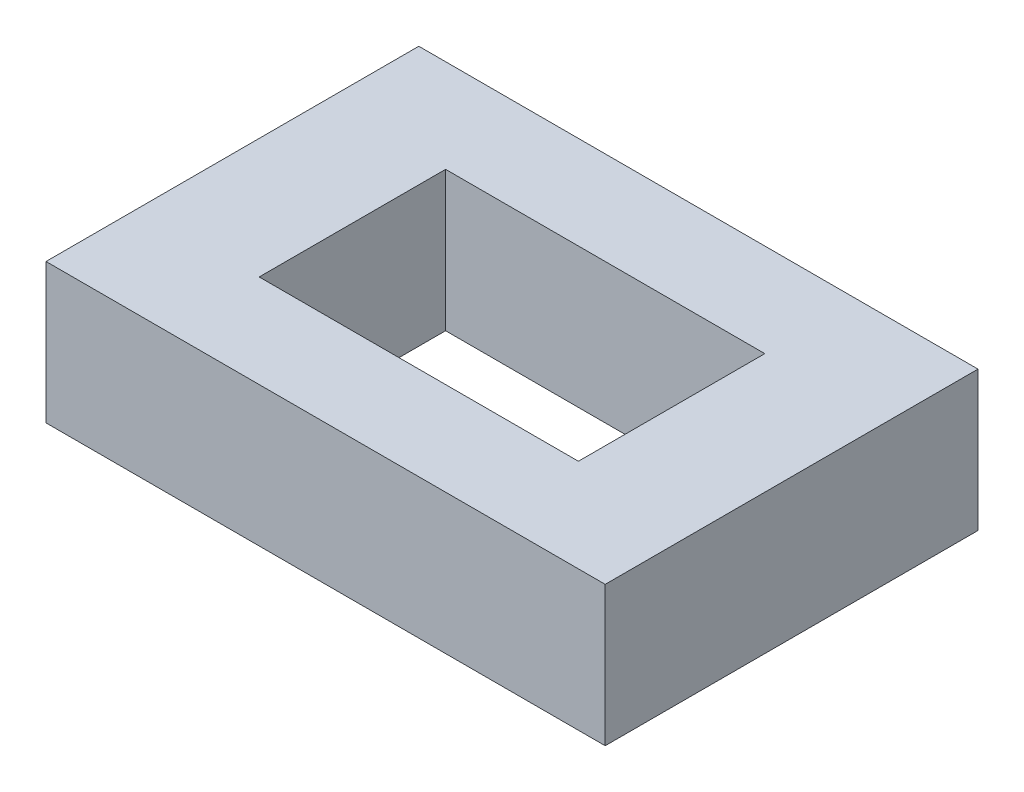
ISO-10303-21;
HEADER;
FILE_DESCRIPTION(('STEP AP214'),'2;1');
FILE_NAME('part.step','',(''),(''),'','','');
FILE_SCHEMA(('AUTOMOTIVE_DESIGN { 1 0 10303 214 1 1 1 1 }'));
ENDSEC;
DATA;
#1=APPLICATION_CONTEXT('core data for automotive mechanical design processes');
#2=APPLICATION_PROTOCOL_DEFINITION('international standard','automotive_design',2000,#1);
#3=PRODUCT_CONTEXT('',#1,'mechanical');
#4=PRODUCT('Part','Part','',(#3));
#5=PRODUCT_RELATED_PRODUCT_CATEGORY('part','',(#4));
#6=PRODUCT_DEFINITION_FORMATION('','',#4);
#7=PRODUCT_DEFINITION_CONTEXT('part definition',#1,'design');
#8=PRODUCT_DEFINITION('design','',#6,#7);
#9=PRODUCT_DEFINITION_SHAPE('','',#8);
#10=(LENGTH_UNIT() NAMED_UNIT(*) SI_UNIT(.MILLI.,.METRE.));
#11=(NAMED_UNIT(*) PLANE_ANGLE_UNIT() SI_UNIT($,.RADIAN.));
#12=(NAMED_UNIT(*) SI_UNIT($,.STERADIAN.) SOLID_ANGLE_UNIT());
#13=UNCERTAINTY_MEASURE_WITH_UNIT(LENGTH_MEASURE(1.E-05),#10,'distance_accuracy_value','');
#14=(GEOMETRIC_REPRESENTATION_CONTEXT(3) GLOBAL_UNCERTAINTY_ASSIGNED_CONTEXT((#13)) GLOBAL_UNIT_ASSIGNED_CONTEXT((#10,
#11,#12)) REPRESENTATION_CONTEXT('',''));
#15=CARTESIAN_POINT('',(0.,0.,0.));
#16=DIRECTION('',(0.,0.,1.));
#17=DIRECTION('',(1.,0.,0.));
#18=AXIS2_PLACEMENT_3D('',#15,#16,#17);
#19=CARTESIAN_POINT('',(6.,3.,4.));
#20=DIRECTION('',(-1.,0.,0.));
#21=DIRECTION('',(0.,0.,1.));
#22=AXIS2_PLACEMENT_3D('',#19,#20,#21);
#23=PLANE('',#22);
#24=DIRECTION('',(0.,0.,-1.));
#25=VECTOR('',#24,1.);
#26=CARTESIAN_POINT('',(6.,0.,4.));
#27=LINE('',#26,#25);
#28=CARTESIAN_POINT('',(6.,0.,4.));
#29=VERTEX_POINT('',#28);
#30=CARTESIAN_POINT('',(6.,0.,-4.));
#31=VERTEX_POINT('',#30);
#32=EDGE_CURVE('E151',#29,#31,#27,.T.);
#33=ORIENTED_EDGE('',*,*,#32,.T.);
#34=DIRECTION('',(0.,-1.,0.));
#35=VECTOR('',#34,1.);
#36=CARTESIAN_POINT('',(6.,3.,-4.));
#37=LINE('',#36,#35);
#38=CARTESIAN_POINT('',(6.,3.,-4.));
#39=VERTEX_POINT('',#38);
#40=EDGE_CURVE('E11',#39,#31,#37,.T.);
#41=ORIENTED_EDGE('',*,*,#40,.F.);
#42=DIRECTION('',(0.,0.,-1.));
#43=VECTOR('',#42,1.);
#44=CARTESIAN_POINT('',(6.,3.,4.));
#45=LINE('',#44,#43);
#46=CARTESIAN_POINT('',(6.,3.,4.));
#47=VERTEX_POINT('',#46);
#48=EDGE_CURVE('E157',#47,#39,#45,.T.);
#49=ORIENTED_EDGE('',*,*,#48,.F.);
#50=DIRECTION('',(0.,-1.,0.));
#51=VECTOR('',#50,1.);
#52=CARTESIAN_POINT('',(6.,3.,4.));
#53=LINE('',#52,#51);
#54=EDGE_CURVE('E171',#47,#29,#53,.T.);
#55=ORIENTED_EDGE('',*,*,#54,.T.);
#56=EDGE_LOOP('',(#33,#41,#49,#55));
#57=FACE_BOUND('',#56,.T.);
#58=ADVANCED_FACE('F43',(#57),#23,.F.);
#59=CARTESIAN_POINT('',(-6.,3.,-4.));
#60=DIRECTION('',(0.,0.,1.));
#61=DIRECTION('',(1.,0.,0.));
#62=AXIS2_PLACEMENT_3D('',#59,#60,#61);
#63=PLANE('',#62);
#64=DIRECTION('',(-1.,0.,0.));
#65=VECTOR('',#64,1.);
#66=CARTESIAN_POINT('',(-6.,0.,-4.));
#67=LINE('',#66,#65);
#68=CARTESIAN_POINT('',(-6.,0.,-4.));
#69=VERTEX_POINT('',#68);
#70=EDGE_CURVE('E175',#31,#69,#67,.T.);
#71=ORIENTED_EDGE('',*,*,#70,.T.);
#72=DIRECTION('',(0.,-1.,0.));
#73=VECTOR('',#72,1.);
#74=CARTESIAN_POINT('',(-6.,3.,-4.));
#75=LINE('',#74,#73);
#76=CARTESIAN_POINT('',(-6.,3.,-4.));
#77=VERTEX_POINT('',#76);
#78=EDGE_CURVE('E51',#77,#69,#75,.T.);
#79=ORIENTED_EDGE('',*,*,#78,.F.);
#80=DIRECTION('',(-1.,0.,0.));
#81=VECTOR('',#80,1.);
#82=CARTESIAN_POINT('',(-6.,3.,-4.));
#83=LINE('',#82,#81);
#84=EDGE_CURVE('E161',#39,#77,#83,.T.);
#85=ORIENTED_EDGE('',*,*,#84,.F.);
#86=ORIENTED_EDGE('',*,*,#40,.T.);
#87=EDGE_LOOP('',(#71,#79,#85,#86));
#88=FACE_BOUND('',#87,.T.);
#89=ADVANCED_FACE('F209',(#88),#63,.F.);
#90=CARTESIAN_POINT('',(-6.,3.,4.));
#91=DIRECTION('',(1.,0.,0.));
#92=DIRECTION('',(0.,0.,-1.));
#93=AXIS2_PLACEMENT_3D('',#90,#91,#92);
#94=PLANE('',#93);
#95=DIRECTION('',(0.,0.,1.));
#96=VECTOR('',#95,1.);
#97=CARTESIAN_POINT('',(-6.,0.,4.));
#98=LINE('',#97,#96);
#99=CARTESIAN_POINT('',(-6.,0.,4.));
#100=VERTEX_POINT('',#99);
#101=EDGE_CURVE('E178',#69,#100,#98,.T.);
#102=ORIENTED_EDGE('',*,*,#101,.T.);
#103=DIRECTION('',(0.,-1.,0.));
#104=VECTOR('',#103,1.);
#105=CARTESIAN_POINT('',(-6.,3.,4.));
#106=LINE('',#105,#104);
#107=CARTESIAN_POINT('',(-6.,3.,4.));
#108=VERTEX_POINT('',#107);
#109=EDGE_CURVE('E186',#108,#100,#106,.T.);
#110=ORIENTED_EDGE('',*,*,#109,.F.);
#111=DIRECTION('',(0.,0.,1.));
#112=VECTOR('',#111,1.);
#113=CARTESIAN_POINT('',(-6.,3.,4.));
#114=LINE('',#113,#112);
#115=EDGE_CURVE('E165',#77,#108,#114,.T.);
#116=ORIENTED_EDGE('',*,*,#115,.F.);
#117=ORIENTED_EDGE('',*,*,#78,.T.);
#118=EDGE_LOOP('',(#102,#110,#116,#117));
#119=FACE_BOUND('',#118,.T.);
#120=ADVANCED_FACE('F195',(#119),#94,.F.);
#121=CARTESIAN_POINT('',(-6.,3.,4.));
#122=DIRECTION('',(0.,0.,-1.));
#123=DIRECTION('',(-1.,0.,0.));
#124=AXIS2_PLACEMENT_3D('',#121,#122,#123);
#125=PLANE('',#124);
#126=DIRECTION('',(1.,0.,0.));
#127=VECTOR('',#126,1.);
#128=CARTESIAN_POINT('',(-6.,0.,4.));
#129=LINE('',#128,#127);
#130=EDGE_CURVE('E162',#100,#29,#129,.T.);
#131=ORIENTED_EDGE('',*,*,#130,.T.);
#132=ORIENTED_EDGE('',*,*,#54,.F.);
#133=DIRECTION('',(1.,0.,0.));
#134=VECTOR('',#133,1.);
#135=CARTESIAN_POINT('',(-6.,3.,4.));
#136=LINE('',#135,#134);
#137=EDGE_CURVE('E168',#108,#47,#136,.T.);
#138=ORIENTED_EDGE('',*,*,#137,.F.);
#139=ORIENTED_EDGE('',*,*,#109,.T.);
#140=EDGE_LOOP('',(#131,#132,#138,#139));
#141=FACE_BOUND('',#140,.T.);
#142=ADVANCED_FACE('F202',(#141),#125,.F.);
#143=CARTESIAN_POINT('',(0.,3.,0.));
#144=DIRECTION('',(0.,-1.,0.));
#145=DIRECTION('',(0.,0.,-1.));
#146=AXIS2_PLACEMENT_3D('',#143,#144,#145);
#147=PLANE('',#146);
#148=DIRECTION('',(-1.,0.,0.));
#149=VECTOR('',#148,1.);
#150=CARTESIAN_POINT('',(-3.425,3.,-2.));
#151=LINE('',#150,#149);
#152=CARTESIAN_POINT('',(3.425,3.,-2.));
#153=VERTEX_POINT('',#152);
#154=CARTESIAN_POINT('',(-3.425,3.,-2.));
#155=VERTEX_POINT('',#154);
#156=EDGE_CURVE('E142',#153,#155,#151,.T.);
#157=ORIENTED_EDGE('',*,*,#156,.F.);
#158=DIRECTION('',(0.,0.,-1.));
#159=VECTOR('',#158,1.);
#160=CARTESIAN_POINT('',(3.425,3.,2.));
#161=LINE('',#160,#159);
#162=CARTESIAN_POINT('',(3.425,3.,2.));
#163=VERTEX_POINT('',#162);
#164=EDGE_CURVE('E58',#163,#153,#161,.T.);
#165=ORIENTED_EDGE('',*,*,#164,.F.);
#166=DIRECTION('',(1.,0.,0.));
#167=VECTOR('',#166,1.);
#168=CARTESIAN_POINT('',(-3.425,3.,2.));
#169=LINE('',#168,#167);
#170=CARTESIAN_POINT('',(-3.425,3.,2.));
#171=VERTEX_POINT('',#170);
#172=EDGE_CURVE('E129',#171,#163,#169,.T.);
#173=ORIENTED_EDGE('',*,*,#172,.F.);
#174=DIRECTION('',(0.,0.,1.));
#175=VECTOR('',#174,1.);
#176=CARTESIAN_POINT('',(-3.425,3.,2.));
#177=LINE('',#176,#175);
#178=EDGE_CURVE('E133',#155,#171,#177,.T.);
#179=ORIENTED_EDGE('',*,*,#178,.F.);
#180=EDGE_LOOP('',(#157,#165,#173,#179));
#181=FACE_BOUND('',#180,.T.);
#182=ORIENTED_EDGE('',*,*,#48,.T.);
#183=ORIENTED_EDGE('',*,*,#84,.T.);
#184=ORIENTED_EDGE('',*,*,#115,.T.);
#185=ORIENTED_EDGE('',*,*,#137,.T.);
#186=EDGE_LOOP('',(#182,#183,#184,#185));
#187=FACE_BOUND('',#186,.T.);
#188=ADVANCED_FACE('F208',(#181,#187),#147,.F.);
#189=CARTESIAN_POINT('',(0.,0.,0.));
#190=DIRECTION('',(0.,-1.,0.));
#191=DIRECTION('',(0.,0.,-1.));
#192=AXIS2_PLACEMENT_3D('',#189,#190,#191);
#193=PLANE('',#192);
#194=DIRECTION('',(0.,0.,-1.));
#195=VECTOR('',#194,1.);
#196=CARTESIAN_POINT('',(3.425,0.,2.));
#197=LINE('',#196,#195);
#198=CARTESIAN_POINT('',(3.425,0.,2.));
#199=VERTEX_POINT('',#198);
#200=CARTESIAN_POINT('',(3.425,0.,-2.));
#201=VERTEX_POINT('',#200);
#202=EDGE_CURVE('E110',#199,#201,#197,.T.);
#203=ORIENTED_EDGE('',*,*,#202,.T.);
#204=DIRECTION('',(-1.,0.,0.));
#205=VECTOR('',#204,1.);
#206=CARTESIAN_POINT('',(-3.425,0.,-2.));
#207=LINE('',#206,#205);
#208=CARTESIAN_POINT('',(-3.425,0.,-2.));
#209=VERTEX_POINT('',#208);
#210=EDGE_CURVE('E120',#201,#209,#207,.T.);
#211=ORIENTED_EDGE('',*,*,#210,.T.);
#212=DIRECTION('',(0.,0.,1.));
#213=VECTOR('',#212,1.);
#214=CARTESIAN_POINT('',(-3.425,0.,2.));
#215=LINE('',#214,#213);
#216=CARTESIAN_POINT('',(-3.425,0.,2.));
#217=VERTEX_POINT('',#216);
#218=EDGE_CURVE('E66',#209,#217,#215,.T.);
#219=ORIENTED_EDGE('',*,*,#218,.T.);
#220=DIRECTION('',(1.,0.,0.));
#221=VECTOR('',#220,1.);
#222=CARTESIAN_POINT('',(-3.425,0.,2.));
#223=LINE('',#222,#221);
#224=EDGE_CURVE('E117',#217,#199,#223,.T.);
#225=ORIENTED_EDGE('',*,*,#224,.T.);
#226=EDGE_LOOP('',(#203,#211,#219,#225));
#227=FACE_BOUND('',#226,.T.);
#228=ORIENTED_EDGE('',*,*,#32,.F.);
#229=ORIENTED_EDGE('',*,*,#130,.F.);
#230=ORIENTED_EDGE('',*,*,#101,.F.);
#231=ORIENTED_EDGE('',*,*,#70,.F.);
#232=EDGE_LOOP('',(#228,#229,#230,#231));
#233=FACE_BOUND('',#232,.T.);
#234=ADVANCED_FACE('F125',(#227,#233),#193,.T.);
#235=CARTESIAN_POINT('',(3.425,0.,2.));
#236=DIRECTION('',(1.,0.,0.));
#237=DIRECTION('',(0.,0.,-1.));
#238=AXIS2_PLACEMENT_3D('',#235,#236,#237);
#239=PLANE('',#238);
#240=ORIENTED_EDGE('',*,*,#164,.T.);
#241=DIRECTION('',(0.,1.,0.));
#242=VECTOR('',#241,1.);
#243=CARTESIAN_POINT('',(3.425,0.,-2.));
#244=LINE('',#243,#242);
#245=EDGE_CURVE('E106',#201,#153,#244,.T.);
#246=ORIENTED_EDGE('',*,*,#245,.F.);
#247=ORIENTED_EDGE('',*,*,#202,.F.);
#248=DIRECTION('',(0.,1.,0.));
#249=VECTOR('',#248,1.);
#250=CARTESIAN_POINT('',(3.425,0.,2.));
#251=LINE('',#250,#249);
#252=EDGE_CURVE('E148',#199,#163,#251,.T.);
#253=ORIENTED_EDGE('',*,*,#252,.T.);
#254=EDGE_LOOP('',(#240,#246,#247,#253));
#255=FACE_BOUND('',#254,.T.);
#256=ADVANCED_FACE('F108',(#255),#239,.F.);
#257=CARTESIAN_POINT('',(-3.425,0.,2.));
#258=DIRECTION('',(0.,0.,1.));
#259=DIRECTION('',(1.,0.,0.));
#260=AXIS2_PLACEMENT_3D('',#257,#258,#259);
#261=PLANE('',#260);
#262=ORIENTED_EDGE('',*,*,#172,.T.);
#263=ORIENTED_EDGE('',*,*,#252,.F.);
#264=ORIENTED_EDGE('',*,*,#224,.F.);
#265=DIRECTION('',(0.,1.,0.));
#266=VECTOR('',#265,1.);
#267=CARTESIAN_POINT('',(-3.425,0.,2.));
#268=LINE('',#267,#266);
#269=EDGE_CURVE('E152',#217,#171,#268,.T.);
#270=ORIENTED_EDGE('',*,*,#269,.T.);
#271=EDGE_LOOP('',(#262,#263,#264,#270));
#272=FACE_BOUND('',#271,.T.);
#273=ADVANCED_FACE('F226',(#272),#261,.F.);
#274=CARTESIAN_POINT('',(-3.425,0.,2.));
#275=DIRECTION('',(-1.,0.,0.));
#276=DIRECTION('',(0.,0.,1.));
#277=AXIS2_PLACEMENT_3D('',#274,#275,#276);
#278=PLANE('',#277);
#279=ORIENTED_EDGE('',*,*,#178,.T.);
#280=ORIENTED_EDGE('',*,*,#269,.F.);
#281=ORIENTED_EDGE('',*,*,#218,.F.);
#282=DIRECTION('',(0.,1.,0.));
#283=VECTOR('',#282,1.);
#284=CARTESIAN_POINT('',(-3.425,0.,-2.));
#285=LINE('',#284,#283);
#286=EDGE_CURVE('E116',#209,#155,#285,.T.);
#287=ORIENTED_EDGE('',*,*,#286,.T.);
#288=EDGE_LOOP('',(#279,#280,#281,#287));
#289=FACE_BOUND('',#288,.T.);
#290=ADVANCED_FACE('F229',(#289),#278,.F.);
#291=CARTESIAN_POINT('',(-3.425,0.,-2.));
#292=DIRECTION('',(0.,0.,-1.));
#293=DIRECTION('',(-1.,0.,0.));
#294=AXIS2_PLACEMENT_3D('',#291,#292,#293);
#295=PLANE('',#294);
#296=ORIENTED_EDGE('',*,*,#156,.T.);
#297=ORIENTED_EDGE('',*,*,#286,.F.);
#298=ORIENTED_EDGE('',*,*,#210,.F.);
#299=ORIENTED_EDGE('',*,*,#245,.T.);
#300=EDGE_LOOP('',(#296,#297,#298,#299));
#301=FACE_BOUND('',#300,.T.);
#302=ADVANCED_FACE('F121',(#301),#295,.F.);
#303=CLOSED_SHELL('',(#58,#89,#120,#142,#188,#234,#256,#273,#290,#302));
#304=MANIFOLD_SOLID_BREP('B2',#303);
#305=ADVANCED_BREP_SHAPE_REPRESENTATION('',(#18,#304),#14);
#306=SHAPE_DEFINITION_REPRESENTATION(#9,#305);
ENDSEC;
END-ISO-10303-21;
